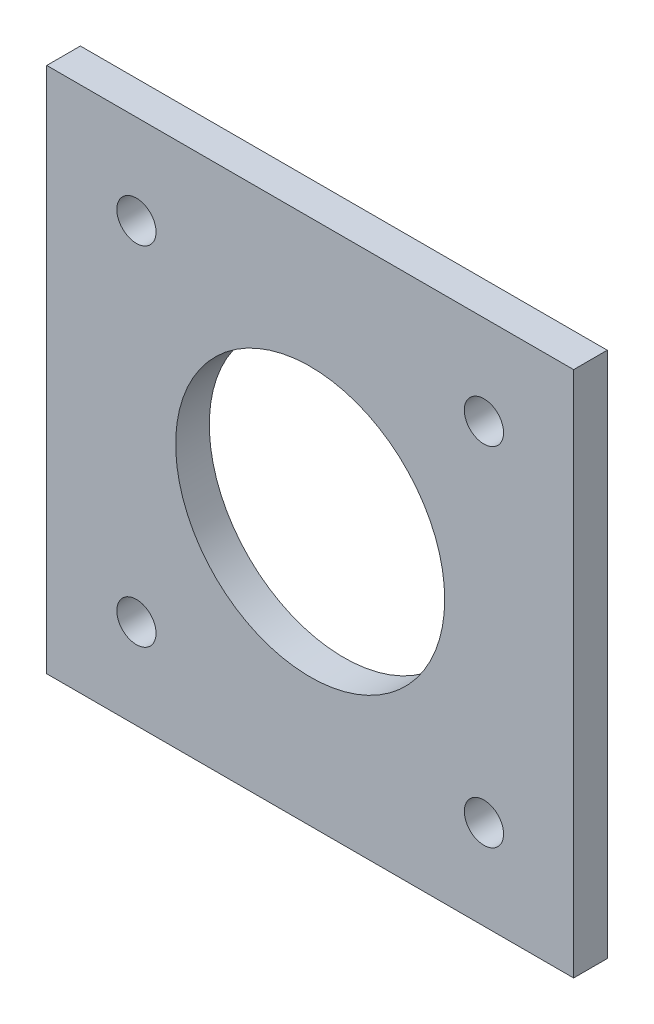
ISO-10303-21;
HEADER;
FILE_DESCRIPTION(('STEP AP214'),'2;1');
FILE_NAME('part.step','',(''),(''),'','','');
FILE_SCHEMA(('AUTOMOTIVE_DESIGN { 1 0 10303 214 1 1 1 1 }'));
ENDSEC;
DATA;
#1=APPLICATION_CONTEXT('core data for automotive mechanical design processes');
#2=APPLICATION_PROTOCOL_DEFINITION('international standard','automotive_design',2000,#1);
#3=PRODUCT_CONTEXT('',#1,'mechanical');
#4=PRODUCT('Part','Part','',(#3));
#5=PRODUCT_RELATED_PRODUCT_CATEGORY('part','',(#4));
#6=PRODUCT_DEFINITION_FORMATION('','',#4);
#7=PRODUCT_DEFINITION_CONTEXT('part definition',#1,'design');
#8=PRODUCT_DEFINITION('design','',#6,#7);
#9=PRODUCT_DEFINITION_SHAPE('','',#8);
#10=(LENGTH_UNIT() NAMED_UNIT(*) SI_UNIT(.MILLI.,.METRE.));
#11=(NAMED_UNIT(*) PLANE_ANGLE_UNIT() SI_UNIT($,.RADIAN.));
#12=(NAMED_UNIT(*) SI_UNIT($,.STERADIAN.) SOLID_ANGLE_UNIT());
#13=UNCERTAINTY_MEASURE_WITH_UNIT(LENGTH_MEASURE(1.E-05),#10,'distance_accuracy_value','');
#14=(GEOMETRIC_REPRESENTATION_CONTEXT(3) GLOBAL_UNCERTAINTY_ASSIGNED_CONTEXT((#13)) GLOBAL_UNIT_ASSIGNED_CONTEXT((#10,
#11,#12)) REPRESENTATION_CONTEXT('',''));
#15=CARTESIAN_POINT('',(0.,0.,0.));
#16=DIRECTION('',(0.,0.,1.));
#17=DIRECTION('',(1.,0.,0.));
#18=AXIS2_PLACEMENT_3D('',#15,#16,#17);
#19=CARTESIAN_POINT('',(0.,0.,3.));
#20=DIRECTION('',(0.,0.,-1.));
#21=DIRECTION('',(-1.,0.,0.));
#22=AXIS2_PLACEMENT_3D('',#19,#20,#21);
#23=PLANE('',#22);
#24=DIRECTION('',(0.,1.,0.));
#25=VECTOR('',#24,1.);
#26=CARTESIAN_POINT('',(23.5,-23.5,3.));
#27=LINE('',#26,#25);
#28=CARTESIAN_POINT('',(23.5,-23.5,3.));
#29=VERTEX_POINT('',#28);
#30=CARTESIAN_POINT('',(23.5,23.5,3.));
#31=VERTEX_POINT('',#30);
#32=EDGE_CURVE('E92',#29,#31,#27,.T.);
#33=ORIENTED_EDGE('',*,*,#32,.T.);
#34=DIRECTION('',(-1.,0.,0.));
#35=VECTOR('',#34,1.);
#36=CARTESIAN_POINT('',(-23.5,23.5,3.));
#37=LINE('',#36,#35);
#38=CARTESIAN_POINT('',(-23.5,23.5,3.));
#39=VERTEX_POINT('',#38);
#40=EDGE_CURVE('E87',#31,#39,#37,.T.);
#41=ORIENTED_EDGE('',*,*,#40,.T.);
#42=DIRECTION('',(0.,-1.,0.));
#43=VECTOR('',#42,1.);
#44=CARTESIAN_POINT('',(-23.5,-23.5,3.));
#45=LINE('',#44,#43);
#46=CARTESIAN_POINT('',(-23.5,-23.5,3.));
#47=VERTEX_POINT('',#46);
#48=EDGE_CURVE('E90',#39,#47,#45,.T.);
#49=ORIENTED_EDGE('',*,*,#48,.T.);
#50=DIRECTION('',(1.,0.,0.));
#51=VECTOR('',#50,1.);
#52=CARTESIAN_POINT('',(-23.5,-23.5,3.));
#53=LINE('',#52,#51);
#54=EDGE_CURVE('E57',#47,#29,#53,.T.);
#55=ORIENTED_EDGE('',*,*,#54,.T.);
#56=EDGE_LOOP('',(#33,#41,#49,#55));
#57=FACE_BOUND('',#56,.T.);
#58=CARTESIAN_POINT('',(-15.5,15.5,3.));
#59=DIRECTION('',(0.,0.,1.));
#60=DIRECTION('',(1.,0.,0.));
#61=AXIS2_PLACEMENT_3D('',#58,#59,#60);
#62=CIRCLE('',#61,1.75);
#63=CARTESIAN_POINT('',(-13.75,15.5,3.));
#64=VERTEX_POINT('',#63);
#65=EDGE_CURVE('E112',#64,#64,#62,.T.);
#66=ORIENTED_EDGE('',*,*,#65,.F.);
#67=EDGE_LOOP('',(#66));
#68=FACE_BOUND('',#67,.T.);
#69=CARTESIAN_POINT('',(0.,1.17961196366423E-13,3.));
#70=DIRECTION('',(0.,0.,1.));
#71=DIRECTION('',(1.,0.,0.));
#72=AXIS2_PLACEMENT_3D('',#69,#70,#71);
#73=CIRCLE('',#72,12.);
#74=CARTESIAN_POINT('',(12.0000000000001,1.17961196366423E-13,3.));
#75=VERTEX_POINT('',#74);
#76=EDGE_CURVE('E134',#75,#75,#73,.T.);
#77=ORIENTED_EDGE('',*,*,#76,.F.);
#78=EDGE_LOOP('',(#77));
#79=FACE_BOUND('',#78,.T.);
#80=CARTESIAN_POINT('',(15.5,15.5000000000001,3.));
#81=DIRECTION('',(0.,0.,1.));
#82=DIRECTION('',(1.,0.,0.));
#83=AXIS2_PLACEMENT_3D('',#80,#81,#82);
#84=CIRCLE('',#83,1.75);
#85=CARTESIAN_POINT('',(17.25,15.5000000000001,3.));
#86=VERTEX_POINT('',#85);
#87=EDGE_CURVE('E142',#86,#86,#84,.T.);
#88=ORIENTED_EDGE('',*,*,#87,.F.);
#89=EDGE_LOOP('',(#88));
#90=FACE_BOUND('',#89,.T.);
#91=CARTESIAN_POINT('',(15.5,-15.4999999999999,3.));
#92=DIRECTION('',(0.,0.,1.));
#93=DIRECTION('',(1.,0.,0.));
#94=AXIS2_PLACEMENT_3D('',#91,#92,#93);
#95=CIRCLE('',#94,1.75);
#96=CARTESIAN_POINT('',(17.25,-15.4999999999999,3.));
#97=VERTEX_POINT('',#96);
#98=EDGE_CURVE('E150',#97,#97,#95,.T.);
#99=ORIENTED_EDGE('',*,*,#98,.F.);
#100=EDGE_LOOP('',(#99));
#101=FACE_BOUND('',#100,.T.);
#102=CARTESIAN_POINT('',(-15.5,-15.4999999999998,3.));
#103=DIRECTION('',(0.,0.,1.));
#104=DIRECTION('',(1.,0.,0.));
#105=AXIS2_PLACEMENT_3D('',#102,#103,#104);
#106=CIRCLE('',#105,1.75);
#107=CARTESIAN_POINT('',(-13.75,-15.4999999999998,3.));
#108=VERTEX_POINT('',#107);
#109=EDGE_CURVE('E158',#108,#108,#106,.T.);
#110=ORIENTED_EDGE('',*,*,#109,.F.);
#111=EDGE_LOOP('',(#110));
#112=FACE_BOUND('',#111,.T.);
#113=ADVANCED_FACE('F39',(#57,#68,#79,#90,#101,#112),#23,.F.);
#114=CARTESIAN_POINT('',(0.,0.,0.));
#115=DIRECTION('',(0.,0.,-1.));
#116=DIRECTION('',(-1.,0.,0.));
#117=AXIS2_PLACEMENT_3D('',#114,#115,#116);
#118=PLANE('',#117);
#119=CARTESIAN_POINT('',(15.5,-15.4999999999999,0.));
#120=DIRECTION('',(0.,0.,1.));
#121=DIRECTION('',(1.,0.,0.));
#122=AXIS2_PLACEMENT_3D('',#119,#120,#121);
#123=CIRCLE('',#122,1.75);
#124=CARTESIAN_POINT('',(17.25,-15.4999999999999,0.));
#125=VERTEX_POINT('',#124);
#126=EDGE_CURVE('E154',#125,#125,#123,.T.);
#127=ORIENTED_EDGE('',*,*,#126,.T.);
#128=EDGE_LOOP('',(#127));
#129=FACE_BOUND('',#128,.T.);
#130=CARTESIAN_POINT('',(0.,1.17961196366423E-13,0.));
#131=DIRECTION('',(0.,0.,1.));
#132=DIRECTION('',(1.,0.,0.));
#133=AXIS2_PLACEMENT_3D('',#130,#131,#132);
#134=CIRCLE('',#133,12.);
#135=CARTESIAN_POINT('',(12.0000000000001,1.17961196366423E-13,0.));
#136=VERTEX_POINT('',#135);
#137=EDGE_CURVE('E138',#136,#136,#134,.T.);
#138=ORIENTED_EDGE('',*,*,#137,.T.);
#139=EDGE_LOOP('',(#138));
#140=FACE_BOUND('',#139,.T.);
#141=DIRECTION('',(0.,1.,0.));
#142=VECTOR('',#141,1.);
#143=CARTESIAN_POINT('',(23.5,-23.5,0.));
#144=LINE('',#143,#142);
#145=CARTESIAN_POINT('',(23.5,-23.5,0.));
#146=VERTEX_POINT('',#145);
#147=CARTESIAN_POINT('',(23.5,23.5,0.));
#148=VERTEX_POINT('',#147);
#149=EDGE_CURVE('E108',#146,#148,#144,.T.);
#150=ORIENTED_EDGE('',*,*,#149,.F.);
#151=DIRECTION('',(1.,0.,0.));
#152=VECTOR('',#151,1.);
#153=CARTESIAN_POINT('',(-23.5,-23.5,0.));
#154=LINE('',#153,#152);
#155=CARTESIAN_POINT('',(-23.5,-23.5,0.));
#156=VERTEX_POINT('',#155);
#157=EDGE_CURVE('E80',#156,#146,#154,.T.);
#158=ORIENTED_EDGE('',*,*,#157,.F.);
#159=DIRECTION('',(0.,-1.,0.));
#160=VECTOR('',#159,1.);
#161=CARTESIAN_POINT('',(-23.5,-23.5,0.));
#162=LINE('',#161,#160);
#163=CARTESIAN_POINT('',(-23.5,23.5,0.));
#164=VERTEX_POINT('',#163);
#165=EDGE_CURVE('E74',#164,#156,#162,.T.);
#166=ORIENTED_EDGE('',*,*,#165,.F.);
#167=DIRECTION('',(-1.,0.,0.));
#168=VECTOR('',#167,1.);
#169=CARTESIAN_POINT('',(-23.5,23.5,0.));
#170=LINE('',#169,#168);
#171=EDGE_CURVE('E97',#148,#164,#170,.T.);
#172=ORIENTED_EDGE('',*,*,#171,.F.);
#173=EDGE_LOOP('',(#150,#158,#166,#172));
#174=FACE_BOUND('',#173,.T.);
#175=CARTESIAN_POINT('',(-15.5,15.5,0.));
#176=DIRECTION('',(0.,0.,1.));
#177=DIRECTION('',(1.,0.,0.));
#178=AXIS2_PLACEMENT_3D('',#175,#176,#177);
#179=CIRCLE('',#178,1.75);
#180=CARTESIAN_POINT('',(-13.75,15.5,0.));
#181=VERTEX_POINT('',#180);
#182=EDGE_CURVE('E130',#181,#181,#179,.T.);
#183=ORIENTED_EDGE('',*,*,#182,.T.);
#184=EDGE_LOOP('',(#183));
#185=FACE_BOUND('',#184,.T.);
#186=CARTESIAN_POINT('',(15.5,15.5000000000001,0.));
#187=DIRECTION('',(0.,0.,1.));
#188=DIRECTION('',(1.,0.,0.));
#189=AXIS2_PLACEMENT_3D('',#186,#187,#188);
#190=CIRCLE('',#189,1.75);
#191=CARTESIAN_POINT('',(17.25,15.5000000000001,0.));
#192=VERTEX_POINT('',#191);
#193=EDGE_CURVE('E146',#192,#192,#190,.T.);
#194=ORIENTED_EDGE('',*,*,#193,.T.);
#195=EDGE_LOOP('',(#194));
#196=FACE_BOUND('',#195,.T.);
#197=CARTESIAN_POINT('',(-15.5,-15.4999999999998,0.));
#198=DIRECTION('',(0.,0.,1.));
#199=DIRECTION('',(1.,0.,0.));
#200=AXIS2_PLACEMENT_3D('',#197,#198,#199);
#201=CIRCLE('',#200,1.75);
#202=CARTESIAN_POINT('',(-13.75,-15.4999999999998,0.));
#203=VERTEX_POINT('',#202);
#204=EDGE_CURVE('E162',#203,#203,#201,.T.);
#205=ORIENTED_EDGE('',*,*,#204,.T.);
#206=EDGE_LOOP('',(#205));
#207=FACE_BOUND('',#206,.T.);
#208=ADVANCED_FACE('F125',(#129,#140,#174,#185,#196,#207),#118,.T.);
#209=CARTESIAN_POINT('',(23.5,-23.5,3.));
#210=DIRECTION('',(-1.,0.,0.));
#211=DIRECTION('',(0.,0.,1.));
#212=AXIS2_PLACEMENT_3D('',#209,#210,#211);
#213=PLANE('',#212);
#214=ORIENTED_EDGE('',*,*,#149,.T.);
#215=DIRECTION('',(0.,0.,-1.));
#216=VECTOR('',#215,1.);
#217=CARTESIAN_POINT('',(23.5,23.5,3.));
#218=LINE('',#217,#216);
#219=EDGE_CURVE('E11',#31,#148,#218,.T.);
#220=ORIENTED_EDGE('',*,*,#219,.F.);
#221=ORIENTED_EDGE('',*,*,#32,.F.);
#222=DIRECTION('',(0.,0.,-1.));
#223=VECTOR('',#222,1.);
#224=CARTESIAN_POINT('',(23.5,-23.5,3.));
#225=LINE('',#224,#223);
#226=EDGE_CURVE('E104',#29,#146,#225,.T.);
#227=ORIENTED_EDGE('',*,*,#226,.T.);
#228=EDGE_LOOP('',(#214,#220,#221,#227));
#229=FACE_BOUND('',#228,.T.);
#230=ADVANCED_FACE('F41',(#229),#213,.F.);
#231=CARTESIAN_POINT('',(-23.5,23.5,3.));
#232=DIRECTION('',(0.,-1.,0.));
#233=DIRECTION('',(0.,0.,-1.));
#234=AXIS2_PLACEMENT_3D('',#231,#232,#233);
#235=PLANE('',#234);
#236=ORIENTED_EDGE('',*,*,#171,.T.);
#237=DIRECTION('',(0.,0.,-1.));
#238=VECTOR('',#237,1.);
#239=CARTESIAN_POINT('',(-23.5,23.5,3.));
#240=LINE('',#239,#238);
#241=EDGE_CURVE('E49',#39,#164,#240,.T.);
#242=ORIENTED_EDGE('',*,*,#241,.F.);
#243=ORIENTED_EDGE('',*,*,#40,.F.);
#244=ORIENTED_EDGE('',*,*,#219,.T.);
#245=EDGE_LOOP('',(#236,#242,#243,#244));
#246=FACE_BOUND('',#245,.T.);
#247=ADVANCED_FACE('F96',(#246),#235,.F.);
#248=CARTESIAN_POINT('',(-23.5,-23.5,3.));
#249=DIRECTION('',(1.,0.,0.));
#250=DIRECTION('',(0.,0.,-1.));
#251=AXIS2_PLACEMENT_3D('',#248,#249,#250);
#252=PLANE('',#251);
#253=ORIENTED_EDGE('',*,*,#165,.T.);
#254=DIRECTION('',(0.,0.,-1.));
#255=VECTOR('',#254,1.);
#256=CARTESIAN_POINT('',(-23.5,-23.5,3.));
#257=LINE('',#256,#255);
#258=EDGE_CURVE('E99',#47,#156,#257,.T.);
#259=ORIENTED_EDGE('',*,*,#258,.F.);
#260=ORIENTED_EDGE('',*,*,#48,.F.);
#261=ORIENTED_EDGE('',*,*,#241,.T.);
#262=EDGE_LOOP('',(#253,#259,#260,#261));
#263=FACE_BOUND('',#262,.T.);
#264=ADVANCED_FACE('F100',(#263),#252,.F.);
#265=CARTESIAN_POINT('',(-23.5,-23.5,3.));
#266=DIRECTION('',(0.,1.,0.));
#267=DIRECTION('',(0.,0.,1.));
#268=AXIS2_PLACEMENT_3D('',#265,#266,#267);
#269=PLANE('',#268);
#270=ORIENTED_EDGE('',*,*,#157,.T.);
#271=ORIENTED_EDGE('',*,*,#226,.F.);
#272=ORIENTED_EDGE('',*,*,#54,.F.);
#273=ORIENTED_EDGE('',*,*,#258,.T.);
#274=EDGE_LOOP('',(#270,#271,#272,#273));
#275=FACE_BOUND('',#274,.T.);
#276=ADVANCED_FACE('F122',(#275),#269,.F.);
#277=CARTESIAN_POINT('',(-15.5,15.5,3.));
#278=DIRECTION('',(0.,0.,-1.));
#279=DIRECTION('',(-1.,0.,0.));
#280=AXIS2_PLACEMENT_3D('',#277,#278,#279);
#281=CYLINDRICAL_SURFACE('',#280,1.75);
#282=ORIENTED_EDGE('',*,*,#65,.T.);
#283=EDGE_LOOP('',(#282));
#284=FACE_BOUND('',#283,.T.);
#285=ORIENTED_EDGE('',*,*,#182,.F.);
#286=EDGE_LOOP('',(#285));
#287=FACE_BOUND('',#286,.T.);
#288=ADVANCED_FACE('F181',(#284,#287),#281,.F.);
#289=CARTESIAN_POINT('',(0.,1.17961196366423E-13,3.));
#290=DIRECTION('',(0.,0.,-1.));
#291=DIRECTION('',(-1.,0.,0.));
#292=AXIS2_PLACEMENT_3D('',#289,#290,#291);
#293=CYLINDRICAL_SURFACE('',#292,12.);
#294=ORIENTED_EDGE('',*,*,#76,.T.);
#295=EDGE_LOOP('',(#294));
#296=FACE_BOUND('',#295,.T.);
#297=ORIENTED_EDGE('',*,*,#137,.F.);
#298=EDGE_LOOP('',(#297));
#299=FACE_BOUND('',#298,.T.);
#300=ADVANCED_FACE('F227',(#296,#299),#293,.F.);
#301=CARTESIAN_POINT('',(15.5,15.5000000000001,3.));
#302=DIRECTION('',(0.,0.,-1.));
#303=DIRECTION('',(-1.,0.,0.));
#304=AXIS2_PLACEMENT_3D('',#301,#302,#303);
#305=CYLINDRICAL_SURFACE('',#304,1.75);
#306=ORIENTED_EDGE('',*,*,#87,.T.);
#307=EDGE_LOOP('',(#306));
#308=FACE_BOUND('',#307,.T.);
#309=ORIENTED_EDGE('',*,*,#193,.F.);
#310=EDGE_LOOP('',(#309));
#311=FACE_BOUND('',#310,.T.);
#312=ADVANCED_FACE('F235',(#308,#311),#305,.F.);
#313=CARTESIAN_POINT('',(15.5,-15.4999999999999,3.));
#314=DIRECTION('',(0.,0.,-1.));
#315=DIRECTION('',(-1.,0.,0.));
#316=AXIS2_PLACEMENT_3D('',#313,#314,#315);
#317=CYLINDRICAL_SURFACE('',#316,1.75);
#318=ORIENTED_EDGE('',*,*,#98,.T.);
#319=EDGE_LOOP('',(#318));
#320=FACE_BOUND('',#319,.T.);
#321=ORIENTED_EDGE('',*,*,#126,.F.);
#322=EDGE_LOOP('',(#321));
#323=FACE_BOUND('',#322,.T.);
#324=ADVANCED_FACE('F243',(#320,#323),#317,.F.);
#325=CARTESIAN_POINT('',(-15.5,-15.4999999999998,3.));
#326=DIRECTION('',(0.,0.,-1.));
#327=DIRECTION('',(-1.,0.,0.));
#328=AXIS2_PLACEMENT_3D('',#325,#326,#327);
#329=CYLINDRICAL_SURFACE('',#328,1.75);
#330=ORIENTED_EDGE('',*,*,#109,.T.);
#331=EDGE_LOOP('',(#330));
#332=FACE_BOUND('',#331,.T.);
#333=ORIENTED_EDGE('',*,*,#204,.F.);
#334=EDGE_LOOP('',(#333));
#335=FACE_BOUND('',#334,.T.);
#336=ADVANCED_FACE('F170',(#332,#335),#329,.F.);
#337=CLOSED_SHELL('',(#113,#208,#230,#247,#264,#276,#288,#300,#312,#324,#336));
#338=MANIFOLD_SOLID_BREP('B2',#337);
#339=ADVANCED_BREP_SHAPE_REPRESENTATION('',(#18,#338),#14);
#340=SHAPE_DEFINITION_REPRESENTATION(#9,#339);
ENDSEC;
END-ISO-10303-21;
